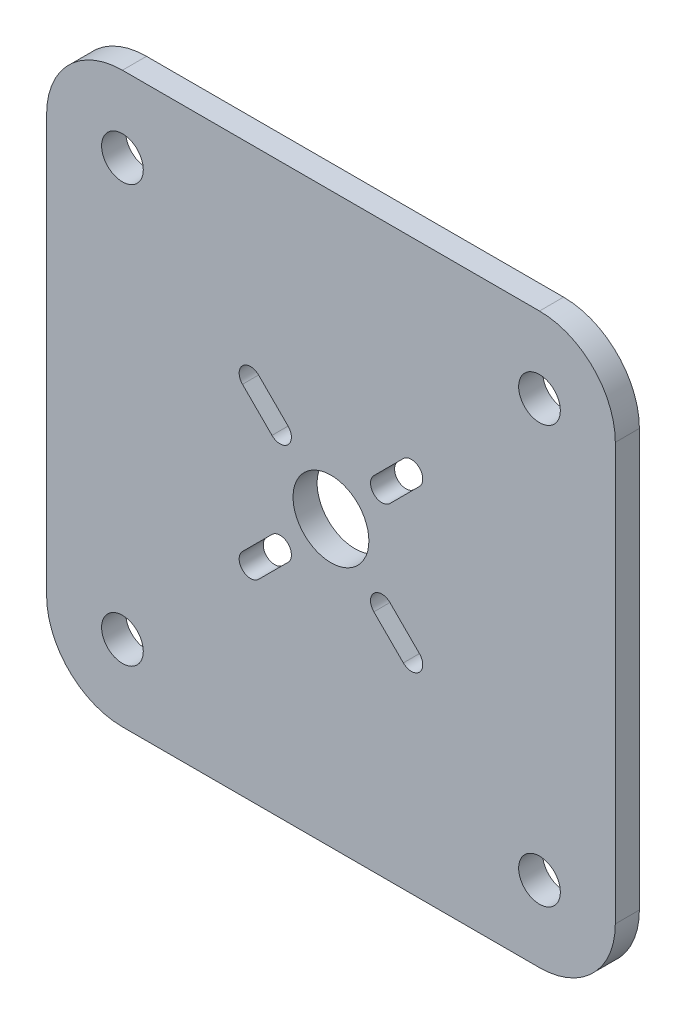
ISO-10303-21;
HEADER;
FILE_DESCRIPTION(('STEP AP214'),'2;1');
FILE_NAME('part.step','',(''),(''),'','','');
FILE_SCHEMA(('AUTOMOTIVE_DESIGN { 1 0 10303 214 1 1 1 1 }'));
ENDSEC;
DATA;
#1=APPLICATION_CONTEXT('core data for automotive mechanical design processes');
#2=APPLICATION_PROTOCOL_DEFINITION('international standard','automotive_design',2000,#1);
#3=PRODUCT_CONTEXT('',#1,'mechanical');
#4=PRODUCT('Part','Part','',(#3));
#5=PRODUCT_RELATED_PRODUCT_CATEGORY('part','',(#4));
#6=PRODUCT_DEFINITION_FORMATION('','',#4);
#7=PRODUCT_DEFINITION_CONTEXT('part definition',#1,'design');
#8=PRODUCT_DEFINITION('design','',#6,#7);
#9=PRODUCT_DEFINITION_SHAPE('','',#8);
#10=(LENGTH_UNIT() NAMED_UNIT(*) SI_UNIT(.MILLI.,.METRE.));
#11=(NAMED_UNIT(*) PLANE_ANGLE_UNIT() SI_UNIT($,.RADIAN.));
#12=(NAMED_UNIT(*) SI_UNIT($,.STERADIAN.) SOLID_ANGLE_UNIT());
#13=UNCERTAINTY_MEASURE_WITH_UNIT(LENGTH_MEASURE(1.E-05),#10,'distance_accuracy_value','');
#14=(GEOMETRIC_REPRESENTATION_CONTEXT(3) GLOBAL_UNCERTAINTY_ASSIGNED_CONTEXT((#13)) GLOBAL_UNIT_ASSIGNED_CONTEXT((#10,
#11,#12)) REPRESENTATION_CONTEXT('',''));
#15=CARTESIAN_POINT('',(0.,0.,0.));
#16=DIRECTION('',(0.,0.,1.));
#17=DIRECTION('',(1.,0.,0.));
#18=AXIS2_PLACEMENT_3D('',#15,#16,#17);
#19=CARTESIAN_POINT('',(0.,0.,154.3));
#20=DIRECTION('',(0.,0.,-1.));
#21=DIRECTION('',(-1.,0.,0.));
#22=AXIS2_PLACEMENT_3D('',#19,#20,#21);
#23=PLANE('',#22);
#24=DIRECTION('',(-0.707106781186553,0.707106781186542,0.));
#25=VECTOR('',#24,1.);
#26=CARTESIAN_POINT('',(-5.65685424949248,287.178174593052,154.3));
#27=LINE('',#26,#25);
#28=CARTESIAN_POINT('',(-5.65685424949249,287.178174593052,154.3));
#29=VERTEX_POINT('',#28);
#30=CARTESIAN_POINT('',(-9.54594154601848,291.067261889578,154.3));
#31=VERTEX_POINT('',#30);
#32=EDGE_CURVE('E382',#29,#31,#27,.T.);
#33=ORIENTED_EDGE('',*,*,#32,.F.);
#34=CARTESIAN_POINT('',(-6.71751442127226,286.117514421272,154.3));
#35=DIRECTION('',(0.,0.,1.));
#36=DIRECTION('',(1.,0.,0.));
#37=AXIS2_PLACEMENT_3D('',#34,#35,#36);
#38=CIRCLE('',#37,1.49999999999998);
#39=CARTESIAN_POINT('',(-7.77817459305211,285.056854249492,154.3));
#40=VERTEX_POINT('',#39);
#41=EDGE_CURVE('E312',#40,#29,#38,.T.);
#42=ORIENTED_EDGE('',*,*,#41,.F.);
#43=DIRECTION('',(0.707106781186542,-0.707106781186553,0.));
#44=VECTOR('',#43,1.);
#45=CARTESIAN_POINT('',(-7.7781745930521,285.056854249492,154.3));
#46=LINE('',#45,#44);
#47=CARTESIAN_POINT('',(-11.6672618895781,288.945941546018,154.3));
#48=VERTEX_POINT('',#47);
#49=EDGE_CURVE('E386',#48,#40,#46,.T.);
#50=ORIENTED_EDGE('',*,*,#49,.F.);
#51=CARTESIAN_POINT('',(-10.6066017177982,290.006601717798,154.3));
#52=DIRECTION('',(0.,0.,1.));
#53=DIRECTION('',(1.,0.,0.));
#54=AXIS2_PLACEMENT_3D('',#51,#52,#53);
#55=CIRCLE('',#54,1.49999999999994);
#56=EDGE_CURVE('E384',#31,#48,#55,.T.);
#57=ORIENTED_EDGE('',*,*,#56,.F.);
#58=EDGE_LOOP('',(#33,#42,#50,#57));
#59=FACE_BOUND('',#58,.T.);
#60=DIRECTION('',(-0.707106781186542,-0.707106781186553,0.));
#61=VECTOR('',#60,1.);
#62=CARTESIAN_POINT('',(-7.77817459305202,273.743145750508,154.3));
#63=LINE('',#62,#61);
#64=CARTESIAN_POINT('',(-7.77817459305203,273.743145750508,154.3));
#65=VERTEX_POINT('',#64);
#66=CARTESIAN_POINT('',(-11.667261889578,269.854058453982,154.3));
#67=VERTEX_POINT('',#66);
#68=EDGE_CURVE('E373',#65,#67,#63,.T.);
#69=ORIENTED_EDGE('',*,*,#68,.F.);
#70=CARTESIAN_POINT('',(-6.71751442127223,272.682485578728,154.3));
#71=DIRECTION('',(0.,0.,1.));
#72=DIRECTION('',(1.,0.,0.));
#73=AXIS2_PLACEMENT_3D('',#70,#71,#72);
#74=CIRCLE('',#73,1.49999999999997);
#75=CARTESIAN_POINT('',(-5.65685424949243,271.621825406948,154.3));
#76=VERTEX_POINT('',#75);
#77=EDGE_CURVE('E379',#76,#65,#74,.T.);
#78=ORIENTED_EDGE('',*,*,#77,.F.);
#79=DIRECTION('',(0.707106781186553,0.707106781186542,0.));
#80=VECTOR('',#79,1.);
#81=CARTESIAN_POINT('',(-5.65685424949242,271.621825406948,154.3));
#82=LINE('',#81,#80);
#83=CARTESIAN_POINT('',(-9.54594154601845,267.732738110422,154.3));
#84=VERTEX_POINT('',#83);
#85=EDGE_CURVE('E377',#84,#76,#82,.T.);
#86=ORIENTED_EDGE('',*,*,#85,.F.);
#87=CARTESIAN_POINT('',(-10.6066017177982,268.793398282202,154.3));
#88=DIRECTION('',(0.,0.,1.));
#89=DIRECTION('',(1.,0.,0.));
#90=AXIS2_PLACEMENT_3D('',#87,#88,#89);
#91=CIRCLE('',#90,1.49999999999993);
#92=EDGE_CURVE('E375',#67,#84,#91,.T.);
#93=ORIENTED_EDGE('',*,*,#92,.F.);
#94=EDGE_LOOP('',(#69,#78,#86,#93));
#95=FACE_BOUND('',#94,.T.);
#96=DIRECTION('',(0.707106781186553,-0.707106781186542,0.));
#97=VECTOR('',#96,1.);
#98=CARTESIAN_POINT('',(5.65685424949236,271.621825406948,154.3));
#99=LINE('',#98,#97);
#100=CARTESIAN_POINT('',(5.65685424949236,271.621825406948,154.3));
#101=VERTEX_POINT('',#100);
#102=CARTESIAN_POINT('',(9.54594154601841,267.732738110422,154.3));
#103=VERTEX_POINT('',#102);
#104=EDGE_CURVE('E366',#101,#103,#99,.T.);
#105=ORIENTED_EDGE('',*,*,#104,.F.);
#106=CARTESIAN_POINT('',(6.71751442127222,272.682485578728,154.3));
#107=DIRECTION('',(0.,0.,1.));
#108=DIRECTION('',(1.,0.,0.));
#109=AXIS2_PLACEMENT_3D('',#106,#107,#108);
#110=CIRCLE('',#109,1.50000000000004);
#111=CARTESIAN_POINT('',(7.77817459305206,273.743145750508,154.3));
#112=VERTEX_POINT('',#111);
#113=EDGE_CURVE('E371',#112,#101,#110,.T.);
#114=ORIENTED_EDGE('',*,*,#113,.F.);
#115=DIRECTION('',(-0.707106781186543,0.707106781186552,0.));
#116=VECTOR('',#115,1.);
#117=CARTESIAN_POINT('',(7.77817459305205,273.743145750508,154.3));
#118=LINE('',#117,#116);
#119=CARTESIAN_POINT('',(11.667261889578,269.854058453982,154.3));
#120=VERTEX_POINT('',#119);
#121=EDGE_CURVE('E210',#120,#112,#118,.T.);
#122=ORIENTED_EDGE('',*,*,#121,.F.);
#123=CARTESIAN_POINT('',(10.6066017177982,268.793398282202,154.3));
#124=DIRECTION('',(0.,0.,1.));
#125=DIRECTION('',(1.,0.,0.));
#126=AXIS2_PLACEMENT_3D('',#123,#124,#125);
#127=CIRCLE('',#126,1.50000000000001);
#128=EDGE_CURVE('E368',#103,#120,#127,.T.);
#129=ORIENTED_EDGE('',*,*,#128,.F.);
#130=EDGE_LOOP('',(#105,#114,#122,#129));
#131=FACE_BOUND('',#130,.T.);
#132=DIRECTION('',(0.707106781186558,0.707106781186538,0.));
#133=VECTOR('',#132,1.);
#134=CARTESIAN_POINT('',(7.77817459305192,285.056854249492,154.3));
#135=LINE('',#134,#133);
#136=CARTESIAN_POINT('',(7.77817459305193,285.056854249492,154.3));
#137=VERTEX_POINT('',#136);
#138=CARTESIAN_POINT('',(11.667261889578,288.945941546018,154.3));
#139=VERTEX_POINT('',#138);
#140=EDGE_CURVE('E301',#137,#139,#135,.T.);
#141=ORIENTED_EDGE('',*,*,#140,.F.);
#142=CARTESIAN_POINT('',(6.71751442127217,286.117514421272,154.3));
#143=DIRECTION('',(0.,0.,1.));
#144=DIRECTION('',(1.,0.,0.));
#145=AXIS2_PLACEMENT_3D('',#142,#143,#144);
#146=CIRCLE('',#145,1.49999999999993);
#147=CARTESIAN_POINT('',(5.65685424949239,287.178174593052,154.3));
#148=VERTEX_POINT('',#147);
#149=EDGE_CURVE('E363',#148,#137,#146,.T.);
#150=ORIENTED_EDGE('',*,*,#149,.F.);
#151=DIRECTION('',(-0.707106781186538,-0.707106781186557,0.));
#152=VECTOR('',#151,1.);
#153=CARTESIAN_POINT('',(5.65685424949239,287.178174593052,154.3));
#154=LINE('',#153,#152);
#155=CARTESIAN_POINT('',(9.54594154601836,291.067261889578,154.3));
#156=VERTEX_POINT('',#155);
#157=EDGE_CURVE('E361',#156,#148,#154,.T.);
#158=ORIENTED_EDGE('',*,*,#157,.F.);
#159=CARTESIAN_POINT('',(10.6066017177982,290.006601717798,154.3));
#160=DIRECTION('',(0.,0.,1.));
#161=DIRECTION('',(1.,0.,0.));
#162=AXIS2_PLACEMENT_3D('',#159,#160,#161);
#163=CIRCLE('',#162,1.50000000000001);
#164=EDGE_CURVE('E359',#139,#156,#163,.T.);
#165=ORIENTED_EDGE('',*,*,#164,.F.);
#166=EDGE_LOOP('',(#141,#150,#158,#165));
#167=FACE_BOUND('',#166,.T.);
#168=DIRECTION('',(-1.,0.,0.));
#169=VECTOR('',#168,1.);
#170=CARTESIAN_POINT('',(-37.5,316.9,154.3));
#171=LINE('',#170,#169);
#172=CARTESIAN_POINT('',(27.5,316.9,154.3));
#173=VERTEX_POINT('',#172);
#174=CARTESIAN_POINT('',(-27.4999999999999,316.9,154.3));
#175=VERTEX_POINT('',#174);
#176=EDGE_CURVE('E340',#173,#175,#171,.T.);
#177=ORIENTED_EDGE('',*,*,#176,.T.);
#178=CARTESIAN_POINT('',(-27.4999999999999,306.9,154.3));
#179=DIRECTION('',(0.,0.,-1.));
#180=DIRECTION('',(-1.,0.,0.));
#181=AXIS2_PLACEMENT_3D('',#178,#179,#180);
#182=CIRCLE('',#181,10.);
#183=CARTESIAN_POINT('',(-37.5,306.9,154.3));
#184=VERTEX_POINT('',#183);
#185=EDGE_CURVE('E412',#175,#184,#182,.F.);
#186=ORIENTED_EDGE('',*,*,#185,.T.);
#187=DIRECTION('',(0.,-1.,0.));
#188=VECTOR('',#187,1.);
#189=CARTESIAN_POINT('',(-37.5,241.9,154.3));
#190=LINE('',#189,#188);
#191=CARTESIAN_POINT('',(-37.5,251.9,154.3));
#192=VERTEX_POINT('',#191);
#193=EDGE_CURVE('E344',#184,#192,#190,.T.);
#194=ORIENTED_EDGE('',*,*,#193,.T.);
#195=CARTESIAN_POINT('',(-27.4999999999999,251.9,154.3));
#196=DIRECTION('',(0.,0.,-1.));
#197=DIRECTION('',(-1.,0.,0.));
#198=AXIS2_PLACEMENT_3D('',#195,#196,#197);
#199=CIRCLE('',#198,10.);
#200=CARTESIAN_POINT('',(-27.4999999999999,241.9,154.3));
#201=VERTEX_POINT('',#200);
#202=EDGE_CURVE('E61',#192,#201,#199,.F.);
#203=ORIENTED_EDGE('',*,*,#202,.T.);
#204=DIRECTION('',(1.,0.,0.));
#205=VECTOR('',#204,1.);
#206=CARTESIAN_POINT('',(-37.5,241.9,154.3));
#207=LINE('',#206,#205);
#208=CARTESIAN_POINT('',(27.5,241.9,154.3));
#209=VERTEX_POINT('',#208);
#210=EDGE_CURVE('E346',#201,#209,#207,.T.);
#211=ORIENTED_EDGE('',*,*,#210,.T.);
#212=CARTESIAN_POINT('',(27.5,251.9,154.3));
#213=DIRECTION('',(0.,0.,-1.));
#214=DIRECTION('',(-1.,0.,0.));
#215=AXIS2_PLACEMENT_3D('',#212,#213,#214);
#216=CIRCLE('',#215,10.);
#217=CARTESIAN_POINT('',(37.5,251.9,154.3));
#218=VERTEX_POINT('',#217);
#219=EDGE_CURVE('E409',#209,#218,#216,.F.);
#220=ORIENTED_EDGE('',*,*,#219,.T.);
#221=DIRECTION('',(0.,1.,0.));
#222=VECTOR('',#221,1.);
#223=CARTESIAN_POINT('',(37.5,241.9,154.3));
#224=LINE('',#223,#222);
#225=CARTESIAN_POINT('',(37.5,306.9,154.3));
#226=VERTEX_POINT('',#225);
#227=EDGE_CURVE('E337',#218,#226,#224,.T.);
#228=ORIENTED_EDGE('',*,*,#227,.T.);
#229=CARTESIAN_POINT('',(27.5,306.9,154.3));
#230=DIRECTION('',(0.,0.,-1.));
#231=DIRECTION('',(-1.,0.,0.));
#232=AXIS2_PLACEMENT_3D('',#229,#230,#231);
#233=CIRCLE('',#232,10.);
#234=EDGE_CURVE('E407',#226,#173,#233,.F.);
#235=ORIENTED_EDGE('',*,*,#234,.T.);
#236=EDGE_LOOP('',(#177,#186,#194,#203,#211,#220,#228,#235));
#237=FACE_BOUND('',#236,.T.);
#238=CARTESIAN_POINT('',(-27.5,251.9,154.3));
#239=DIRECTION('',(0.,0.,1.));
#240=DIRECTION('',(1.,0.,0.));
#241=AXIS2_PLACEMENT_3D('',#238,#239,#240);
#242=CIRCLE('',#241,2.75);
#243=CARTESIAN_POINT('',(-24.75,251.9,154.3));
#244=VERTEX_POINT('',#243);
#245=EDGE_CURVE('E331',#244,#244,#242,.T.);
#246=ORIENTED_EDGE('',*,*,#245,.F.);
#247=EDGE_LOOP('',(#246));
#248=FACE_BOUND('',#247,.T.);
#249=CARTESIAN_POINT('',(27.5,251.9,154.3));
#250=DIRECTION('',(0.,0.,1.));
#251=DIRECTION('',(1.,0.,0.));
#252=AXIS2_PLACEMENT_3D('',#249,#250,#251);
#253=CIRCLE('',#252,2.75);
#254=CARTESIAN_POINT('',(30.25,251.9,154.3));
#255=VERTEX_POINT('',#254);
#256=EDGE_CURVE('E325',#255,#255,#253,.T.);
#257=ORIENTED_EDGE('',*,*,#256,.F.);
#258=EDGE_LOOP('',(#257));
#259=FACE_BOUND('',#258,.T.);
#260=CARTESIAN_POINT('',(27.5,306.9,154.3));
#261=DIRECTION('',(0.,0.,1.));
#262=DIRECTION('',(1.,0.,0.));
#263=AXIS2_PLACEMENT_3D('',#260,#261,#262);
#264=CIRCLE('',#263,2.75);
#265=CARTESIAN_POINT('',(30.25,306.9,154.3));
#266=VERTEX_POINT('',#265);
#267=EDGE_CURVE('E319',#266,#266,#264,.T.);
#268=ORIENTED_EDGE('',*,*,#267,.F.);
#269=EDGE_LOOP('',(#268));
#270=FACE_BOUND('',#269,.T.);
#271=CARTESIAN_POINT('',(-27.5,306.9,154.3));
#272=DIRECTION('',(0.,0.,1.));
#273=DIRECTION('',(1.,0.,0.));
#274=AXIS2_PLACEMENT_3D('',#271,#272,#273);
#275=CIRCLE('',#274,2.75);
#276=CARTESIAN_POINT('',(-24.75,306.9,154.3));
#277=VERTEX_POINT('',#276);
#278=EDGE_CURVE('E313',#277,#277,#275,.T.);
#279=ORIENTED_EDGE('',*,*,#278,.F.);
#280=EDGE_LOOP('',(#279));
#281=FACE_BOUND('',#280,.T.);
#282=CARTESIAN_POINT('',(0.,279.4,154.3));
#283=DIRECTION('',(0.,0.,1.));
#284=DIRECTION('',(1.,0.,0.));
#285=AXIS2_PLACEMENT_3D('',#282,#283,#284);
#286=CIRCLE('',#285,5.);
#287=CARTESIAN_POINT('',(5.,279.4,154.3));
#288=VERTEX_POINT('',#287);
#289=EDGE_CURVE('E305',#288,#288,#286,.T.);
#290=ORIENTED_EDGE('',*,*,#289,.F.);
#291=EDGE_LOOP('',(#290));
#292=FACE_BOUND('',#291,.T.);
#293=ADVANCED_FACE('F39',(#59,#95,#131,#167,#237,#248,#259,#270,#281,#292),#23,.F.);
#294=CARTESIAN_POINT('',(0.,0.,151.125));
#295=DIRECTION('',(0.,0.,-1.));
#296=DIRECTION('',(-1.,0.,0.));
#297=AXIS2_PLACEMENT_3D('',#294,#295,#296);
#298=PLANE('',#297);
#299=CARTESIAN_POINT('',(-6.71751442127226,286.117514421272,151.125));
#300=DIRECTION('',(0.,0.,1.));
#301=DIRECTION('',(1.,0.,0.));
#302=AXIS2_PLACEMENT_3D('',#299,#300,#301);
#303=CIRCLE('',#302,1.49999999999998);
#304=CARTESIAN_POINT('',(-7.7781745930521,285.056854249492,151.125));
#305=VERTEX_POINT('',#304);
#306=CARTESIAN_POINT('',(-5.65685424949248,287.178174593052,151.125));
#307=VERTEX_POINT('',#306);
#308=EDGE_CURVE('E247',#305,#307,#303,.T.);
#309=ORIENTED_EDGE('',*,*,#308,.T.);
#310=DIRECTION('',(-0.707106781186553,0.707106781186542,0.));
#311=VECTOR('',#310,1.);
#312=CARTESIAN_POINT('',(-5.65685424949248,287.178174593052,151.125));
#313=LINE('',#312,#311);
#314=CARTESIAN_POINT('',(-9.54594154601848,291.067261889578,151.125));
#315=VERTEX_POINT('',#314);
#316=EDGE_CURVE('E277',#307,#315,#313,.T.);
#317=ORIENTED_EDGE('',*,*,#316,.T.);
#318=CARTESIAN_POINT('',(-10.6066017177982,290.006601717798,151.125));
#319=DIRECTION('',(0.,0.,1.));
#320=DIRECTION('',(1.,0.,0.));
#321=AXIS2_PLACEMENT_3D('',#318,#319,#320);
#322=CIRCLE('',#321,1.49999999999994);
#323=CARTESIAN_POINT('',(-11.6672618895781,288.945941546018,151.125));
#324=VERTEX_POINT('',#323);
#325=EDGE_CURVE('E274',#315,#324,#322,.T.);
#326=ORIENTED_EDGE('',*,*,#325,.T.);
#327=DIRECTION('',(0.707106781186542,-0.707106781186553,0.));
#328=VECTOR('',#327,1.);
#329=CARTESIAN_POINT('',(-7.7781745930521,285.056854249492,151.125));
#330=LINE('',#329,#328);
#331=EDGE_CURVE('E266',#324,#305,#330,.T.);
#332=ORIENTED_EDGE('',*,*,#331,.T.);
#333=EDGE_LOOP('',(#309,#317,#326,#332));
#334=FACE_BOUND('',#333,.T.);
#335=CARTESIAN_POINT('',(-6.71751442127223,272.682485578728,151.125));
#336=DIRECTION('',(0.,0.,1.));
#337=DIRECTION('',(1.,0.,0.));
#338=AXIS2_PLACEMENT_3D('',#335,#336,#337);
#339=CIRCLE('',#338,1.49999999999997);
#340=CARTESIAN_POINT('',(-5.65685424949242,271.621825406948,151.125));
#341=VERTEX_POINT('',#340);
#342=CARTESIAN_POINT('',(-7.77817459305202,273.743145750508,151.125));
#343=VERTEX_POINT('',#342);
#344=EDGE_CURVE('E215',#341,#343,#339,.T.);
#345=ORIENTED_EDGE('',*,*,#344,.T.);
#346=DIRECTION('',(-0.707106781186542,-0.707106781186553,0.));
#347=VECTOR('',#346,1.);
#348=CARTESIAN_POINT('',(-7.77817459305202,273.743145750508,151.125));
#349=LINE('',#348,#347);
#350=CARTESIAN_POINT('',(-11.667261889578,269.854058453982,151.125));
#351=VERTEX_POINT('',#350);
#352=EDGE_CURVE('E255',#343,#351,#349,.T.);
#353=ORIENTED_EDGE('',*,*,#352,.T.);
#354=CARTESIAN_POINT('',(-10.6066017177982,268.793398282202,151.125));
#355=DIRECTION('',(0.,0.,1.));
#356=DIRECTION('',(1.,0.,0.));
#357=AXIS2_PLACEMENT_3D('',#354,#355,#356);
#358=CIRCLE('',#357,1.49999999999993);
#359=CARTESIAN_POINT('',(-9.54594154601847,267.732738110422,151.125));
#360=VERTEX_POINT('',#359);
#361=EDGE_CURVE('E252',#351,#360,#358,.T.);
#362=ORIENTED_EDGE('',*,*,#361,.T.);
#363=DIRECTION('',(0.707106781186553,0.707106781186542,0.));
#364=VECTOR('',#363,1.);
#365=CARTESIAN_POINT('',(-5.65685424949242,271.621825406948,151.125));
#366=LINE('',#365,#364);
#367=EDGE_CURVE('E243',#360,#341,#366,.T.);
#368=ORIENTED_EDGE('',*,*,#367,.T.);
#369=EDGE_LOOP('',(#345,#353,#362,#368));
#370=FACE_BOUND('',#369,.T.);
#371=CARTESIAN_POINT('',(6.71751442127222,272.682485578728,151.125));
#372=DIRECTION('',(0.,0.,1.));
#373=DIRECTION('',(1.,0.,0.));
#374=AXIS2_PLACEMENT_3D('',#371,#372,#373);
#375=CIRCLE('',#374,1.50000000000004);
#376=CARTESIAN_POINT('',(7.77817459305205,273.743145750508,151.125));
#377=VERTEX_POINT('',#376);
#378=CARTESIAN_POINT('',(5.65685424949236,271.621825406948,151.125));
#379=VERTEX_POINT('',#378);
#380=EDGE_CURVE('E218',#377,#379,#375,.T.);
#381=ORIENTED_EDGE('',*,*,#380,.T.);
#382=DIRECTION('',(0.707106781186553,-0.707106781186542,0.));
#383=VECTOR('',#382,1.);
#384=CARTESIAN_POINT('',(5.65685424949236,271.621825406948,151.125));
#385=LINE('',#384,#383);
#386=CARTESIAN_POINT('',(9.54594154601837,267.732738110422,151.125));
#387=VERTEX_POINT('',#386);
#388=EDGE_CURVE('E225',#379,#387,#385,.T.);
#389=ORIENTED_EDGE('',*,*,#388,.T.);
#390=CARTESIAN_POINT('',(10.6066017177982,268.793398282202,151.125));
#391=DIRECTION('',(0.,0.,1.));
#392=DIRECTION('',(1.,0.,0.));
#393=AXIS2_PLACEMENT_3D('',#390,#391,#392);
#394=CIRCLE('',#393,1.50000000000001);
#395=CARTESIAN_POINT('',(11.667261889578,269.854058453982,151.125));
#396=VERTEX_POINT('',#395);
#397=EDGE_CURVE('E229',#387,#396,#394,.T.);
#398=ORIENTED_EDGE('',*,*,#397,.T.);
#399=DIRECTION('',(-0.707106781186543,0.707106781186552,0.));
#400=VECTOR('',#399,1.);
#401=CARTESIAN_POINT('',(7.77817459305205,273.743145750508,151.125));
#402=LINE('',#401,#400);
#403=EDGE_CURVE('E207',#396,#377,#402,.T.);
#404=ORIENTED_EDGE('',*,*,#403,.T.);
#405=EDGE_LOOP('',(#381,#389,#398,#404));
#406=FACE_BOUND('',#405,.T.);
#407=CARTESIAN_POINT('',(6.71751442127217,286.117514421272,151.125));
#408=DIRECTION('',(0.,0.,1.));
#409=DIRECTION('',(1.,0.,0.));
#410=AXIS2_PLACEMENT_3D('',#407,#408,#409);
#411=CIRCLE('',#410,1.49999999999993);
#412=CARTESIAN_POINT('',(5.65685424949239,287.178174593052,151.125));
#413=VERTEX_POINT('',#412);
#414=CARTESIAN_POINT('',(7.77817459305192,285.056854249492,151.125));
#415=VERTEX_POINT('',#414);
#416=EDGE_CURVE('E224',#413,#415,#411,.T.);
#417=ORIENTED_EDGE('',*,*,#416,.T.);
#418=DIRECTION('',(0.707106781186557,0.707106781186538,0.));
#419=VECTOR('',#418,1.);
#420=CARTESIAN_POINT('',(7.77817459305192,285.056854249492,151.125));
#421=LINE('',#420,#419);
#422=CARTESIAN_POINT('',(11.667261889578,288.945941546018,151.125));
#423=VERTEX_POINT('',#422);
#424=EDGE_CURVE('E284',#415,#423,#421,.T.);
#425=ORIENTED_EDGE('',*,*,#424,.T.);
#426=CARTESIAN_POINT('',(10.6066017177982,290.006601717798,151.125));
#427=DIRECTION('',(0.,0.,1.));
#428=DIRECTION('',(1.,0.,0.));
#429=AXIS2_PLACEMENT_3D('',#426,#427,#428);
#430=CIRCLE('',#429,1.50000000000001);
#431=CARTESIAN_POINT('',(9.54594154601838,291.067261889578,151.125));
#432=VERTEX_POINT('',#431);
#433=EDGE_CURVE('E287',#423,#432,#430,.T.);
#434=ORIENTED_EDGE('',*,*,#433,.T.);
#435=DIRECTION('',(-0.707106781186538,-0.707106781186557,0.));
#436=VECTOR('',#435,1.);
#437=CARTESIAN_POINT('',(5.65685424949239,287.178174593052,151.125));
#438=LINE('',#437,#436);
#439=EDGE_CURVE('E290',#432,#413,#438,.T.);
#440=ORIENTED_EDGE('',*,*,#439,.T.);
#441=EDGE_LOOP('',(#417,#425,#434,#440));
#442=FACE_BOUND('',#441,.T.);
#443=CARTESIAN_POINT('',(-27.5,306.9,151.125));
#444=DIRECTION('',(0.,0.,1.));
#445=DIRECTION('',(1.,0.,0.));
#446=AXIS2_PLACEMENT_3D('',#443,#444,#445);
#447=CIRCLE('',#446,2.75);
#448=CARTESIAN_POINT('',(-24.75,306.9,151.125));
#449=VERTEX_POINT('',#448);
#450=EDGE_CURVE('E308',#449,#449,#447,.T.);
#451=ORIENTED_EDGE('',*,*,#450,.T.);
#452=EDGE_LOOP('',(#451));
#453=FACE_BOUND('',#452,.T.);
#454=CARTESIAN_POINT('',(27.5,251.9,151.125));
#455=DIRECTION('',(0.,0.,1.));
#456=DIRECTION('',(1.,0.,0.));
#457=AXIS2_PLACEMENT_3D('',#454,#455,#456);
#458=CIRCLE('',#457,2.75);
#459=CARTESIAN_POINT('',(30.25,251.9,151.125));
#460=VERTEX_POINT('',#459);
#461=EDGE_CURVE('E322',#460,#460,#458,.T.);
#462=ORIENTED_EDGE('',*,*,#461,.T.);
#463=EDGE_LOOP('',(#462));
#464=FACE_BOUND('',#463,.T.);
#465=DIRECTION('',(0.,-1.,0.));
#466=VECTOR('',#465,1.);
#467=CARTESIAN_POINT('',(-37.5,241.9,151.125));
#468=LINE('',#467,#466);
#469=CARTESIAN_POINT('',(-37.5,306.9,151.125));
#470=VERTEX_POINT('',#469);
#471=CARTESIAN_POINT('',(-37.5,251.9,151.125));
#472=VERTEX_POINT('',#471);
#473=EDGE_CURVE('E354',#470,#472,#468,.T.);
#474=ORIENTED_EDGE('',*,*,#473,.F.);
#475=CARTESIAN_POINT('',(-27.4999999999999,306.9,151.125));
#476=DIRECTION('',(0.,0.,-1.));
#477=DIRECTION('',(-1.,0.,0.));
#478=AXIS2_PLACEMENT_3D('',#475,#476,#477);
#479=CIRCLE('',#478,10.);
#480=CARTESIAN_POINT('',(-27.4999999999999,316.9,151.125));
#481=VERTEX_POINT('',#480);
#482=EDGE_CURVE('E400',#470,#481,#479,.T.);
#483=ORIENTED_EDGE('',*,*,#482,.T.);
#484=DIRECTION('',(-1.,0.,0.));
#485=VECTOR('',#484,1.);
#486=CARTESIAN_POINT('',(-37.5,316.9,151.125));
#487=LINE('',#486,#485);
#488=CARTESIAN_POINT('',(27.5,316.9,151.125));
#489=VERTEX_POINT('',#488);
#490=EDGE_CURVE('E351',#489,#481,#487,.T.);
#491=ORIENTED_EDGE('',*,*,#490,.F.);
#492=CARTESIAN_POINT('',(27.5,306.9,151.125));
#493=DIRECTION('',(0.,0.,-1.));
#494=DIRECTION('',(-1.,0.,0.));
#495=AXIS2_PLACEMENT_3D('',#492,#493,#494);
#496=CIRCLE('',#495,10.);
#497=CARTESIAN_POINT('',(37.5,306.9,151.125));
#498=VERTEX_POINT('',#497);
#499=EDGE_CURVE('E394',#489,#498,#496,.T.);
#500=ORIENTED_EDGE('',*,*,#499,.T.);
#501=DIRECTION('',(0.,1.,0.));
#502=VECTOR('',#501,1.);
#503=CARTESIAN_POINT('',(37.5,241.9,151.125));
#504=LINE('',#503,#502);
#505=CARTESIAN_POINT('',(37.5,251.9,151.125));
#506=VERTEX_POINT('',#505);
#507=EDGE_CURVE('E334',#506,#498,#504,.T.);
#508=ORIENTED_EDGE('',*,*,#507,.F.);
#509=CARTESIAN_POINT('',(27.5,251.9,151.125));
#510=DIRECTION('',(0.,0.,-1.));
#511=DIRECTION('',(-1.,0.,0.));
#512=AXIS2_PLACEMENT_3D('',#509,#510,#511);
#513=CIRCLE('',#512,10.);
#514=CARTESIAN_POINT('',(27.5,241.9,151.125));
#515=VERTEX_POINT('',#514);
#516=EDGE_CURVE('E396',#506,#515,#513,.T.);
#517=ORIENTED_EDGE('',*,*,#516,.T.);
#518=DIRECTION('',(1.,0.,0.));
#519=VECTOR('',#518,1.);
#520=CARTESIAN_POINT('',(-37.5,241.9,151.125));
#521=LINE('',#520,#519);
#522=CARTESIAN_POINT('',(-27.4999999999999,241.9,151.125));
#523=VERTEX_POINT('',#522);
#524=EDGE_CURVE('E341',#523,#515,#521,.T.);
#525=ORIENTED_EDGE('',*,*,#524,.F.);
#526=CARTESIAN_POINT('',(-27.4999999999999,251.9,151.125));
#527=DIRECTION('',(0.,0.,-1.));
#528=DIRECTION('',(-1.,0.,0.));
#529=AXIS2_PLACEMENT_3D('',#526,#527,#528);
#530=CIRCLE('',#529,10.);
#531=EDGE_CURVE('E398',#523,#472,#530,.T.);
#532=ORIENTED_EDGE('',*,*,#531,.T.);
#533=EDGE_LOOP('',(#474,#483,#491,#500,#508,#517,#525,#532));
#534=FACE_BOUND('',#533,.T.);
#535=CARTESIAN_POINT('',(-27.5,251.9,151.125));
#536=DIRECTION('',(0.,0.,1.));
#537=DIRECTION('',(1.,0.,0.));
#538=AXIS2_PLACEMENT_3D('',#535,#536,#537);
#539=CIRCLE('',#538,2.75);
#540=CARTESIAN_POINT('',(-24.75,251.9,151.125));
#541=VERTEX_POINT('',#540);
#542=EDGE_CURVE('E328',#541,#541,#539,.T.);
#543=ORIENTED_EDGE('',*,*,#542,.T.);
#544=EDGE_LOOP('',(#543));
#545=FACE_BOUND('',#544,.T.);
#546=CARTESIAN_POINT('',(27.5,306.9,151.125));
#547=DIRECTION('',(0.,0.,1.));
#548=DIRECTION('',(1.,0.,0.));
#549=AXIS2_PLACEMENT_3D('',#546,#547,#548);
#550=CIRCLE('',#549,2.75);
#551=CARTESIAN_POINT('',(30.25,306.9,151.125));
#552=VERTEX_POINT('',#551);
#553=EDGE_CURVE('E316',#552,#552,#550,.T.);
#554=ORIENTED_EDGE('',*,*,#553,.T.);
#555=EDGE_LOOP('',(#554));
#556=FACE_BOUND('',#555,.T.);
#557=CARTESIAN_POINT('',(0.,279.4,151.125));
#558=DIRECTION('',(0.,0.,1.));
#559=DIRECTION('',(1.,0.,0.));
#560=AXIS2_PLACEMENT_3D('',#557,#558,#559);
#561=CIRCLE('',#560,5.);
#562=CARTESIAN_POINT('',(5.,279.4,151.125));
#563=VERTEX_POINT('',#562);
#564=EDGE_CURVE('E309',#563,#563,#561,.T.);
#565=ORIENTED_EDGE('',*,*,#564,.T.);
#566=EDGE_LOOP('',(#565));
#567=FACE_BOUND('',#566,.T.);
#568=ADVANCED_FACE('F227',(#334,#370,#406,#442,#453,#464,#534,#545,#556,#567),#298,.T.);
#569=CARTESIAN_POINT('',(37.5,241.9,154.3));
#570=DIRECTION('',(-1.,0.,0.));
#571=DIRECTION('',(0.,-1.,0.));
#572=AXIS2_PLACEMENT_3D('',#569,#570,#571);
#573=PLANE('',#572);
#574=ORIENTED_EDGE('',*,*,#227,.F.);
#575=DIRECTION('',(0.,0.,-1.));
#576=VECTOR('',#575,1.);
#577=CARTESIAN_POINT('',(37.5,251.9,154.3));
#578=LINE('',#577,#576);
#579=EDGE_CURVE('E11',#218,#506,#578,.T.);
#580=ORIENTED_EDGE('',*,*,#579,.T.);
#581=ORIENTED_EDGE('',*,*,#507,.T.);
#582=DIRECTION('',(0.,0.,-1.));
#583=VECTOR('',#582,1.);
#584=CARTESIAN_POINT('',(37.5,306.9,154.3));
#585=LINE('',#584,#583);
#586=EDGE_CURVE('E47',#498,#226,#585,.F.);
#587=ORIENTED_EDGE('',*,*,#586,.T.);
#588=EDGE_LOOP('',(#574,#580,#581,#587));
#589=FACE_BOUND('',#588,.T.);
#590=ADVANCED_FACE('F420',(#589),#573,.F.);
#591=CARTESIAN_POINT('',(-37.5,316.9,154.3));
#592=DIRECTION('',(0.,-1.,0.));
#593=DIRECTION('',(0.,0.,-1.));
#594=AXIS2_PLACEMENT_3D('',#591,#592,#593);
#595=PLANE('',#594);
#596=ORIENTED_EDGE('',*,*,#490,.T.);
#597=DIRECTION('',(0.,0.,-1.));
#598=VECTOR('',#597,1.);
#599=CARTESIAN_POINT('',(-27.4999999999999,316.9,154.3));
#600=LINE('',#599,#598);
#601=EDGE_CURVE('E405',#481,#175,#600,.F.);
#602=ORIENTED_EDGE('',*,*,#601,.T.);
#603=ORIENTED_EDGE('',*,*,#176,.F.);
#604=DIRECTION('',(0.,0.,-1.));
#605=VECTOR('',#604,1.);
#606=CARTESIAN_POINT('',(27.5,316.9,154.3));
#607=LINE('',#606,#605);
#608=EDGE_CURVE('E402',#173,#489,#607,.T.);
#609=ORIENTED_EDGE('',*,*,#608,.T.);
#610=EDGE_LOOP('',(#596,#602,#603,#609));
#611=FACE_BOUND('',#610,.T.);
#612=ADVANCED_FACE('F431',(#611),#595,.F.);
#613=CARTESIAN_POINT('',(-37.5,241.9,154.3));
#614=DIRECTION('',(1.,0.,0.));
#615=DIRECTION('',(0.,0.,-1.));
#616=AXIS2_PLACEMENT_3D('',#613,#614,#615);
#617=PLANE('',#616);
#618=ORIENTED_EDGE('',*,*,#193,.F.);
#619=DIRECTION('',(0.,0.,-1.));
#620=VECTOR('',#619,1.);
#621=CARTESIAN_POINT('',(-37.5,306.9,154.3));
#622=LINE('',#621,#620);
#623=EDGE_CURVE('E391',#184,#470,#622,.T.);
#624=ORIENTED_EDGE('',*,*,#623,.T.);
#625=ORIENTED_EDGE('',*,*,#473,.T.);
#626=DIRECTION('',(0.,0.,-1.));
#627=VECTOR('',#626,1.);
#628=CARTESIAN_POINT('',(-37.5,251.9,154.3));
#629=LINE('',#628,#627);
#630=EDGE_CURVE('E348',#472,#192,#629,.F.);
#631=ORIENTED_EDGE('',*,*,#630,.T.);
#632=EDGE_LOOP('',(#618,#624,#625,#631));
#633=FACE_BOUND('',#632,.T.);
#634=ADVANCED_FACE('F442',(#633),#617,.F.);
#635=CARTESIAN_POINT('',(-37.5,241.9,154.3));
#636=DIRECTION('',(0.,1.,0.));
#637=DIRECTION('',(0.,0.,1.));
#638=AXIS2_PLACEMENT_3D('',#635,#636,#637);
#639=PLANE('',#638);
#640=ORIENTED_EDGE('',*,*,#210,.F.);
#641=DIRECTION('',(0.,0.,-1.));
#642=VECTOR('',#641,1.);
#643=CARTESIAN_POINT('',(-27.4999999999999,241.9,154.3));
#644=LINE('',#643,#642);
#645=EDGE_CURVE('E415',#201,#523,#644,.T.);
#646=ORIENTED_EDGE('',*,*,#645,.T.);
#647=ORIENTED_EDGE('',*,*,#524,.T.);
#648=DIRECTION('',(0.,0.,-1.));
#649=VECTOR('',#648,1.);
#650=CARTESIAN_POINT('',(27.5,241.9,154.3));
#651=LINE('',#650,#649);
#652=EDGE_CURVE('E54',#515,#209,#651,.F.);
#653=ORIENTED_EDGE('',*,*,#652,.T.);
#654=EDGE_LOOP('',(#640,#646,#647,#653));
#655=FACE_BOUND('',#654,.T.);
#656=ADVANCED_FACE('F448',(#655),#639,.F.);
#657=CARTESIAN_POINT('',(-27.5,251.9,154.3));
#658=DIRECTION('',(0.,0.,-1.));
#659=DIRECTION('',(-1.,0.,0.));
#660=AXIS2_PLACEMENT_3D('',#657,#658,#659);
#661=CYLINDRICAL_SURFACE('',#660,2.75);
#662=ORIENTED_EDGE('',*,*,#245,.T.);
#663=EDGE_LOOP('',(#662));
#664=FACE_BOUND('',#663,.T.);
#665=ORIENTED_EDGE('',*,*,#542,.F.);
#666=EDGE_LOOP('',(#665));
#667=FACE_BOUND('',#666,.T.);
#668=ADVANCED_FACE('F469',(#664,#667),#661,.F.);
#669=CARTESIAN_POINT('',(27.5,251.9,154.3));
#670=DIRECTION('',(0.,0.,-1.));
#671=DIRECTION('',(-1.,0.,0.));
#672=AXIS2_PLACEMENT_3D('',#669,#670,#671);
#673=CYLINDRICAL_SURFACE('',#672,2.75);
#674=ORIENTED_EDGE('',*,*,#256,.T.);
#675=EDGE_LOOP('',(#674));
#676=FACE_BOUND('',#675,.T.);
#677=ORIENTED_EDGE('',*,*,#461,.F.);
#678=EDGE_LOOP('',(#677));
#679=FACE_BOUND('',#678,.T.);
#680=ADVANCED_FACE('F527',(#676,#679),#673,.F.);
#681=CARTESIAN_POINT('',(27.5,306.9,154.3));
#682=DIRECTION('',(0.,0.,-1.));
#683=DIRECTION('',(-1.,0.,0.));
#684=AXIS2_PLACEMENT_3D('',#681,#682,#683);
#685=CYLINDRICAL_SURFACE('',#684,2.75);
#686=ORIENTED_EDGE('',*,*,#267,.T.);
#687=EDGE_LOOP('',(#686));
#688=FACE_BOUND('',#687,.T.);
#689=ORIENTED_EDGE('',*,*,#553,.F.);
#690=EDGE_LOOP('',(#689));
#691=FACE_BOUND('',#690,.T.);
#692=ADVANCED_FACE('F524',(#688,#691),#685,.F.);
#693=CARTESIAN_POINT('',(-27.5,306.9,154.3));
#694=DIRECTION('',(0.,0.,-1.));
#695=DIRECTION('',(-1.,0.,0.));
#696=AXIS2_PLACEMENT_3D('',#693,#694,#695);
#697=CYLINDRICAL_SURFACE('',#696,2.75);
#698=ORIENTED_EDGE('',*,*,#278,.T.);
#699=EDGE_LOOP('',(#698));
#700=FACE_BOUND('',#699,.T.);
#701=ORIENTED_EDGE('',*,*,#450,.F.);
#702=EDGE_LOOP('',(#701));
#703=FACE_BOUND('',#702,.T.);
#704=ADVANCED_FACE('F520',(#700,#703),#697,.F.);
#705=CARTESIAN_POINT('',(0.,279.4,154.3));
#706=DIRECTION('',(0.,0.,-1.));
#707=DIRECTION('',(-1.,0.,0.));
#708=AXIS2_PLACEMENT_3D('',#705,#706,#707);
#709=CYLINDRICAL_SURFACE('',#708,5.);
#710=ORIENTED_EDGE('',*,*,#289,.T.);
#711=EDGE_LOOP('',(#710));
#712=FACE_BOUND('',#711,.T.);
#713=ORIENTED_EDGE('',*,*,#564,.F.);
#714=EDGE_LOOP('',(#713));
#715=FACE_BOUND('',#714,.T.);
#716=ADVANCED_FACE('F516',(#712,#715),#709,.F.);
#717=CARTESIAN_POINT('',(6.71751442127217,286.117514421272,151.125));
#718=DIRECTION('',(0.,0.,1.));
#719=DIRECTION('',(1.,0.,0.));
#720=AXIS2_PLACEMENT_3D('',#717,#718,#719);
#721=CYLINDRICAL_SURFACE('',#720,1.49999999999993);
#722=DIRECTION('',(0.,0.,1.));
#723=VECTOR('',#722,1.);
#724=CARTESIAN_POINT('',(7.77817459305192,285.056854249492,151.125));
#725=LINE('',#724,#723);
#726=EDGE_CURVE('E293',#415,#137,#725,.T.);
#727=ORIENTED_EDGE('',*,*,#726,.F.);
#728=ORIENTED_EDGE('',*,*,#416,.F.);
#729=DIRECTION('',(0.,0.,1.));
#730=VECTOR('',#729,1.);
#731=CARTESIAN_POINT('',(5.65685424949239,287.178174593052,151.125));
#732=LINE('',#731,#730);
#733=EDGE_CURVE('E297',#413,#148,#732,.T.);
#734=ORIENTED_EDGE('',*,*,#733,.T.);
#735=ORIENTED_EDGE('',*,*,#149,.T.);
#736=EDGE_LOOP('',(#727,#728,#734,#735));
#737=FACE_BOUND('',#736,.T.);
#738=ADVANCED_FACE('F505',(#737),#721,.F.);
#739=CARTESIAN_POINT('',(5.65685424949239,287.178174593052,151.125));
#740=DIRECTION('',(-0.707106781186557,0.707106781186538,0.));
#741=DIRECTION('',(-0.707106781186538,-0.707106781186557,0.));
#742=AXIS2_PLACEMENT_3D('',#739,#740,#741);
#743=PLANE('',#742);
#744=ORIENTED_EDGE('',*,*,#733,.F.);
#745=ORIENTED_EDGE('',*,*,#439,.F.);
#746=DIRECTION('',(0.,0.,1.));
#747=VECTOR('',#746,1.);
#748=CARTESIAN_POINT('',(9.54594154601838,291.067261889578,151.125));
#749=LINE('',#748,#747);
#750=EDGE_CURVE('E294',#432,#156,#749,.T.);
#751=ORIENTED_EDGE('',*,*,#750,.T.);
#752=ORIENTED_EDGE('',*,*,#157,.T.);
#753=EDGE_LOOP('',(#744,#745,#751,#752));
#754=FACE_BOUND('',#753,.T.);
#755=ADVANCED_FACE('F501',(#754),#743,.F.);
#756=CARTESIAN_POINT('',(10.6066017177982,290.006601717798,151.125));
#757=DIRECTION('',(0.,0.,1.));
#758=DIRECTION('',(1.,0.,0.));
#759=AXIS2_PLACEMENT_3D('',#756,#757,#758);
#760=CYLINDRICAL_SURFACE('',#759,1.50000000000001);
#761=ORIENTED_EDGE('',*,*,#750,.F.);
#762=ORIENTED_EDGE('',*,*,#433,.F.);
#763=DIRECTION('',(0.,0.,1.));
#764=VECTOR('',#763,1.);
#765=CARTESIAN_POINT('',(11.667261889578,288.945941546018,151.125));
#766=LINE('',#765,#764);
#767=EDGE_CURVE('E298',#423,#139,#766,.T.);
#768=ORIENTED_EDGE('',*,*,#767,.T.);
#769=ORIENTED_EDGE('',*,*,#164,.T.);
#770=EDGE_LOOP('',(#761,#762,#768,#769));
#771=FACE_BOUND('',#770,.T.);
#772=ADVANCED_FACE('F504',(#771),#760,.F.);
#773=CARTESIAN_POINT('',(7.77817459305192,285.056854249492,151.125));
#774=DIRECTION('',(0.707106781186537,-0.707106781186557,0.));
#775=DIRECTION('',(0.707106781186558,0.707106781186538,0.));
#776=AXIS2_PLACEMENT_3D('',#773,#774,#775);
#777=PLANE('',#776);
#778=ORIENTED_EDGE('',*,*,#767,.F.);
#779=ORIENTED_EDGE('',*,*,#424,.F.);
#780=ORIENTED_EDGE('',*,*,#726,.T.);
#781=ORIENTED_EDGE('',*,*,#140,.T.);
#782=EDGE_LOOP('',(#778,#779,#780,#781));
#783=FACE_BOUND('',#782,.T.);
#784=ADVANCED_FACE('F509',(#783),#777,.F.);
#785=CARTESIAN_POINT('',(6.71751442127222,272.682485578728,151.125));
#786=DIRECTION('',(0.,0.,1.));
#787=DIRECTION('',(1.,0.,0.));
#788=AXIS2_PLACEMENT_3D('',#785,#786,#787);
#789=CYLINDRICAL_SURFACE('',#788,1.50000000000004);
#790=DIRECTION('',(0.,0.,1.));
#791=VECTOR('',#790,1.);
#792=CARTESIAN_POINT('',(5.65685424949236,271.621825406948,151.125));
#793=LINE('',#792,#791);
#794=EDGE_CURVE('E220',#379,#101,#793,.T.);
#795=ORIENTED_EDGE('',*,*,#794,.F.);
#796=ORIENTED_EDGE('',*,*,#380,.F.);
#797=DIRECTION('',(0.,0.,1.));
#798=VECTOR('',#797,1.);
#799=CARTESIAN_POINT('',(7.77817459305205,273.743145750508,151.125));
#800=LINE('',#799,#798);
#801=EDGE_CURVE('E202',#377,#112,#800,.T.);
#802=ORIENTED_EDGE('',*,*,#801,.T.);
#803=ORIENTED_EDGE('',*,*,#113,.T.);
#804=EDGE_LOOP('',(#795,#796,#802,#803));
#805=FACE_BOUND('',#804,.T.);
#806=ADVANCED_FACE('F219',(#805),#789,.F.);
#807=CARTESIAN_POINT('',(7.77817459305205,273.743145750508,151.125));
#808=DIRECTION('',(0.707106781186552,0.707106781186543,0.));
#809=DIRECTION('',(-0.707106781186543,0.707106781186552,0.));
#810=AXIS2_PLACEMENT_3D('',#807,#808,#809);
#811=PLANE('',#810);
#812=ORIENTED_EDGE('',*,*,#801,.F.);
#813=ORIENTED_EDGE('',*,*,#403,.F.);
#814=DIRECTION('',(0.,0.,1.));
#815=VECTOR('',#814,1.);
#816=CARTESIAN_POINT('',(11.667261889578,269.854058453982,151.125));
#817=LINE('',#816,#815);
#818=EDGE_CURVE('E214',#396,#120,#817,.T.);
#819=ORIENTED_EDGE('',*,*,#818,.T.);
#820=ORIENTED_EDGE('',*,*,#121,.T.);
#821=EDGE_LOOP('',(#812,#813,#819,#820));
#822=FACE_BOUND('',#821,.T.);
#823=ADVANCED_FACE('F204',(#822),#811,.F.);
#824=CARTESIAN_POINT('',(10.6066017177982,268.793398282202,151.125));
#825=DIRECTION('',(0.,0.,1.));
#826=DIRECTION('',(1.,0.,0.));
#827=AXIS2_PLACEMENT_3D('',#824,#825,#826);
#828=CYLINDRICAL_SURFACE('',#827,1.50000000000001);
#829=ORIENTED_EDGE('',*,*,#818,.F.);
#830=ORIENTED_EDGE('',*,*,#397,.F.);
#831=DIRECTION('',(0.,0.,1.));
#832=VECTOR('',#831,1.);
#833=CARTESIAN_POINT('',(9.54594154601842,267.732738110422,151.125));
#834=LINE('',#833,#832);
#835=EDGE_CURVE('E232',#387,#103,#834,.T.);
#836=ORIENTED_EDGE('',*,*,#835,.T.);
#837=ORIENTED_EDGE('',*,*,#128,.T.);
#838=EDGE_LOOP('',(#829,#830,#836,#837));
#839=FACE_BOUND('',#838,.T.);
#840=ADVANCED_FACE('F629',(#839),#828,.F.);
#841=CARTESIAN_POINT('',(5.65685424949236,271.621825406948,151.125));
#842=DIRECTION('',(-0.707106781186542,-0.707106781186553,0.));
#843=DIRECTION('',(0.707106781186553,-0.707106781186542,0.));
#844=AXIS2_PLACEMENT_3D('',#841,#842,#843);
#845=PLANE('',#844);
#846=ORIENTED_EDGE('',*,*,#835,.F.);
#847=ORIENTED_EDGE('',*,*,#388,.F.);
#848=ORIENTED_EDGE('',*,*,#794,.T.);
#849=ORIENTED_EDGE('',*,*,#104,.T.);
#850=EDGE_LOOP('',(#846,#847,#848,#849));
#851=FACE_BOUND('',#850,.T.);
#852=ADVANCED_FACE('F638',(#851),#845,.F.);
#853=CARTESIAN_POINT('',(-6.71751442127223,272.682485578728,151.125));
#854=DIRECTION('',(0.,0.,1.));
#855=DIRECTION('',(1.,0.,0.));
#856=AXIS2_PLACEMENT_3D('',#853,#854,#855);
#857=CYLINDRICAL_SURFACE('',#856,1.49999999999997);
#858=DIRECTION('',(0.,0.,1.));
#859=VECTOR('',#858,1.);
#860=CARTESIAN_POINT('',(-7.77817459305202,273.743145750508,151.125));
#861=LINE('',#860,#859);
#862=EDGE_CURVE('E240',#343,#65,#861,.T.);
#863=ORIENTED_EDGE('',*,*,#862,.F.);
#864=ORIENTED_EDGE('',*,*,#344,.F.);
#865=DIRECTION('',(0.,0.,1.));
#866=VECTOR('',#865,1.);
#867=CARTESIAN_POINT('',(-5.65685424949242,271.621825406948,151.125));
#868=LINE('',#867,#866);
#869=EDGE_CURVE('E244',#341,#76,#868,.T.);
#870=ORIENTED_EDGE('',*,*,#869,.T.);
#871=ORIENTED_EDGE('',*,*,#77,.T.);
#872=EDGE_LOOP('',(#863,#864,#870,#871));
#873=FACE_BOUND('',#872,.T.);
#874=ADVANCED_FACE('F648',(#873),#857,.F.);
#875=CARTESIAN_POINT('',(-5.65685424949242,271.621825406948,151.125));
#876=DIRECTION('',(0.707106781186542,-0.707106781186553,0.));
#877=DIRECTION('',(0.707106781186553,0.707106781186542,0.));
#878=AXIS2_PLACEMENT_3D('',#875,#876,#877);
#879=PLANE('',#878);
#880=ORIENTED_EDGE('',*,*,#869,.F.);
#881=ORIENTED_EDGE('',*,*,#367,.F.);
#882=DIRECTION('',(0.,0.,1.));
#883=VECTOR('',#882,1.);
#884=CARTESIAN_POINT('',(-9.54594154601847,267.732738110422,151.125));
#885=LINE('',#884,#883);
#886=EDGE_CURVE('E241',#360,#84,#885,.T.);
#887=ORIENTED_EDGE('',*,*,#886,.T.);
#888=ORIENTED_EDGE('',*,*,#85,.T.);
#889=EDGE_LOOP('',(#880,#881,#887,#888));
#890=FACE_BOUND('',#889,.T.);
#891=ADVANCED_FACE('F658',(#890),#879,.F.);
#892=CARTESIAN_POINT('',(-10.6066017177982,268.793398282202,151.125));
#893=DIRECTION('',(0.,0.,1.));
#894=DIRECTION('',(1.,0.,0.));
#895=AXIS2_PLACEMENT_3D('',#892,#893,#894);
#896=CYLINDRICAL_SURFACE('',#895,1.49999999999993);
#897=ORIENTED_EDGE('',*,*,#886,.F.);
#898=ORIENTED_EDGE('',*,*,#361,.F.);
#899=DIRECTION('',(0.,0.,1.));
#900=VECTOR('',#899,1.);
#901=CARTESIAN_POINT('',(-11.667261889578,269.854058453982,151.125));
#902=LINE('',#901,#900);
#903=EDGE_CURVE('E237',#351,#67,#902,.T.);
#904=ORIENTED_EDGE('',*,*,#903,.T.);
#905=ORIENTED_EDGE('',*,*,#92,.T.);
#906=EDGE_LOOP('',(#897,#898,#904,#905));
#907=FACE_BOUND('',#906,.T.);
#908=ADVANCED_FACE('F668',(#907),#896,.F.);
#909=CARTESIAN_POINT('',(-7.77817459305202,273.743145750508,151.125));
#910=DIRECTION('',(-0.707106781186552,0.707106781186542,0.));
#911=DIRECTION('',(-0.707106781186542,-0.707106781186553,0.));
#912=AXIS2_PLACEMENT_3D('',#909,#910,#911);
#913=PLANE('',#912);
#914=ORIENTED_EDGE('',*,*,#903,.F.);
#915=ORIENTED_EDGE('',*,*,#352,.F.);
#916=ORIENTED_EDGE('',*,*,#862,.T.);
#917=ORIENTED_EDGE('',*,*,#68,.T.);
#918=EDGE_LOOP('',(#914,#915,#916,#917));
#919=FACE_BOUND('',#918,.T.);
#920=ADVANCED_FACE('F677',(#919),#913,.F.);
#921=CARTESIAN_POINT('',(-6.71751442127226,286.117514421272,151.125));
#922=DIRECTION('',(0.,0.,1.));
#923=DIRECTION('',(1.,0.,0.));
#924=AXIS2_PLACEMENT_3D('',#921,#922,#923);
#925=CYLINDRICAL_SURFACE('',#924,1.49999999999998);
#926=DIRECTION('',(0.,0.,1.));
#927=VECTOR('',#926,1.);
#928=CARTESIAN_POINT('',(-5.65685424949248,287.178174593052,151.125));
#929=LINE('',#928,#927);
#930=EDGE_CURVE('E263',#307,#29,#929,.T.);
#931=ORIENTED_EDGE('',*,*,#930,.F.);
#932=ORIENTED_EDGE('',*,*,#308,.F.);
#933=DIRECTION('',(0.,0.,1.));
#934=VECTOR('',#933,1.);
#935=CARTESIAN_POINT('',(-7.7781745930521,285.056854249492,151.125));
#936=LINE('',#935,#934);
#937=EDGE_CURVE('E267',#305,#40,#936,.T.);
#938=ORIENTED_EDGE('',*,*,#937,.T.);
#939=ORIENTED_EDGE('',*,*,#41,.T.);
#940=EDGE_LOOP('',(#931,#932,#938,#939));
#941=FACE_BOUND('',#940,.T.);
#942=ADVANCED_FACE('F495',(#941),#925,.F.);
#943=CARTESIAN_POINT('',(-7.7781745930521,285.056854249492,151.125));
#944=DIRECTION('',(-0.707106781186552,-0.707106781186542,0.));
#945=DIRECTION('',(0.707106781186542,-0.707106781186553,0.));
#946=AXIS2_PLACEMENT_3D('',#943,#944,#945);
#947=PLANE('',#946);
#948=ORIENTED_EDGE('',*,*,#937,.F.);
#949=ORIENTED_EDGE('',*,*,#331,.F.);
#950=DIRECTION('',(0.,0.,1.));
#951=VECTOR('',#950,1.);
#952=CARTESIAN_POINT('',(-11.6672618895781,288.945941546018,151.125));
#953=LINE('',#952,#951);
#954=EDGE_CURVE('E264',#324,#48,#953,.T.);
#955=ORIENTED_EDGE('',*,*,#954,.T.);
#956=ORIENTED_EDGE('',*,*,#49,.T.);
#957=EDGE_LOOP('',(#948,#949,#955,#956));
#958=FACE_BOUND('',#957,.T.);
#959=ADVANCED_FACE('F490',(#958),#947,.F.);
#960=CARTESIAN_POINT('',(-10.6066017177982,290.006601717798,151.125));
#961=DIRECTION('',(0.,0.,1.));
#962=DIRECTION('',(1.,0.,0.));
#963=AXIS2_PLACEMENT_3D('',#960,#961,#962);
#964=CYLINDRICAL_SURFACE('',#963,1.49999999999994);
#965=ORIENTED_EDGE('',*,*,#954,.F.);
#966=ORIENTED_EDGE('',*,*,#325,.F.);
#967=DIRECTION('',(0.,0.,1.));
#968=VECTOR('',#967,1.);
#969=CARTESIAN_POINT('',(-9.54594154601848,291.067261889578,151.125));
#970=LINE('',#969,#968);
#971=EDGE_CURVE('E260',#315,#31,#970,.T.);
#972=ORIENTED_EDGE('',*,*,#971,.T.);
#973=ORIENTED_EDGE('',*,*,#56,.T.);
#974=EDGE_LOOP('',(#965,#966,#972,#973));
#975=FACE_BOUND('',#974,.T.);
#976=ADVANCED_FACE('F484',(#975),#964,.F.);
#977=CARTESIAN_POINT('',(-5.65685424949248,287.178174593052,151.125));
#978=DIRECTION('',(0.707106781186542,0.707106781186553,0.));
#979=DIRECTION('',(-0.707106781186553,0.707106781186542,0.));
#980=AXIS2_PLACEMENT_3D('',#977,#978,#979);
#981=PLANE('',#980);
#982=ORIENTED_EDGE('',*,*,#971,.F.);
#983=ORIENTED_EDGE('',*,*,#316,.F.);
#984=ORIENTED_EDGE('',*,*,#930,.T.);
#985=ORIENTED_EDGE('',*,*,#32,.T.);
#986=EDGE_LOOP('',(#982,#983,#984,#985));
#987=FACE_BOUND('',#986,.T.);
#988=ADVANCED_FACE('F481',(#987),#981,.F.);
#989=CARTESIAN_POINT('',(-27.4999999999999,306.9,154.3));
#990=DIRECTION('',(0.,0.,-1.));
#991=DIRECTION('',(-1.,0.,0.));
#992=AXIS2_PLACEMENT_3D('',#989,#990,#991);
#993=CYLINDRICAL_SURFACE('',#992,10.);
#994=ORIENTED_EDGE('',*,*,#185,.F.);
#995=ORIENTED_EDGE('',*,*,#601,.F.);
#996=ORIENTED_EDGE('',*,*,#482,.F.);
#997=ORIENTED_EDGE('',*,*,#623,.F.);
#998=EDGE_LOOP('',(#994,#995,#996,#997));
#999=FACE_BOUND('',#998,.T.);
#1000=ADVANCED_FACE('F439',(#999),#993,.T.);
#1001=CARTESIAN_POINT('',(-27.4999999999999,251.9,154.3));
#1002=DIRECTION('',(0.,0.,-1.));
#1003=DIRECTION('',(-1.,0.,0.));
#1004=AXIS2_PLACEMENT_3D('',#1001,#1002,#1003);
#1005=CYLINDRICAL_SURFACE('',#1004,10.);
#1006=ORIENTED_EDGE('',*,*,#202,.F.);
#1007=ORIENTED_EDGE('',*,*,#630,.F.);
#1008=ORIENTED_EDGE('',*,*,#531,.F.);
#1009=ORIENTED_EDGE('',*,*,#645,.F.);
#1010=EDGE_LOOP('',(#1006,#1007,#1008,#1009));
#1011=FACE_BOUND('',#1010,.T.);
#1012=ADVANCED_FACE('F446',(#1011),#1005,.T.);
#1013=CARTESIAN_POINT('',(27.5,251.9,154.3));
#1014=DIRECTION('',(0.,0.,-1.));
#1015=DIRECTION('',(-1.,0.,0.));
#1016=AXIS2_PLACEMENT_3D('',#1013,#1014,#1015);
#1017=CYLINDRICAL_SURFACE('',#1016,10.);
#1018=ORIENTED_EDGE('',*,*,#219,.F.);
#1019=ORIENTED_EDGE('',*,*,#652,.F.);
#1020=ORIENTED_EDGE('',*,*,#516,.F.);
#1021=ORIENTED_EDGE('',*,*,#579,.F.);
#1022=EDGE_LOOP('',(#1018,#1019,#1020,#1021));
#1023=FACE_BOUND('',#1022,.T.);
#1024=ADVANCED_FACE('F450',(#1023),#1017,.T.);
#1025=CARTESIAN_POINT('',(27.5,306.9,154.3));
#1026=DIRECTION('',(0.,0.,-1.));
#1027=DIRECTION('',(-1.,0.,0.));
#1028=AXIS2_PLACEMENT_3D('',#1025,#1026,#1027);
#1029=CYLINDRICAL_SURFACE('',#1028,10.);
#1030=ORIENTED_EDGE('',*,*,#234,.F.);
#1031=ORIENTED_EDGE('',*,*,#586,.F.);
#1032=ORIENTED_EDGE('',*,*,#499,.F.);
#1033=ORIENTED_EDGE('',*,*,#608,.F.);
#1034=EDGE_LOOP('',(#1030,#1031,#1032,#1033));
#1035=FACE_BOUND('',#1034,.T.);
#1036=ADVANCED_FACE('F41',(#1035),#1029,.T.);
#1037=CLOSED_SHELL('',(#293,#568,#590,#612,#634,#656,#668,#680,#692,#704,#716,#738,#755,#772,
#784,#806,#823,#840,#852,#874,#891,#908,#920,#942,#959,#976,#988,#1000,#1012,#1024,#1036));
#1038=MANIFOLD_SOLID_BREP('B2',#1037);
#1039=ADVANCED_BREP_SHAPE_REPRESENTATION('',(#18,#1038),#14);
#1040=SHAPE_DEFINITION_REPRESENTATION(#9,#1039);
ENDSEC;
END-ISO-10303-21;
